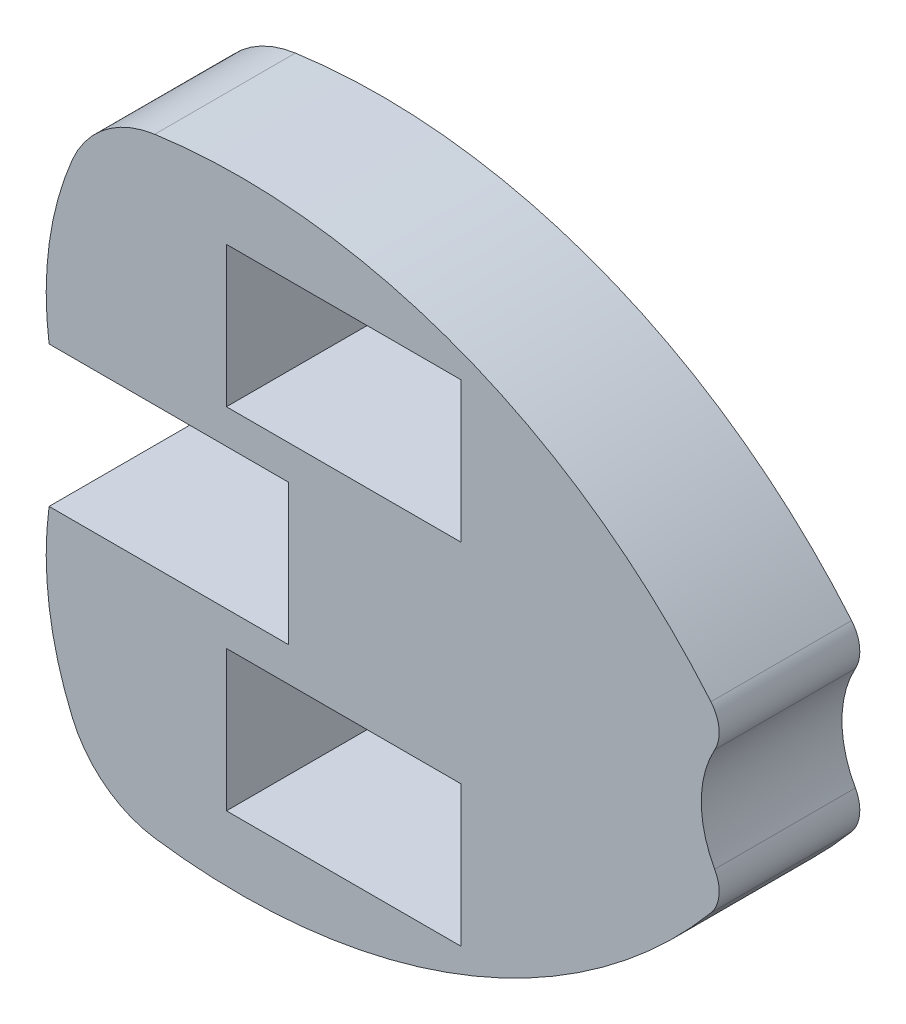
ISO-10303-21;
HEADER;
FILE_DESCRIPTION(('STEP AP214'),'2;1');
FILE_NAME('part.step','',(''),(''),'','','');
FILE_SCHEMA(('AUTOMOTIVE_DESIGN { 1 0 10303 214 1 1 1 1 }'));
ENDSEC;
DATA;
#1=APPLICATION_CONTEXT('core data for automotive mechanical design processes');
#2=APPLICATION_PROTOCOL_DEFINITION('international standard','automotive_design',2000,#1);
#3=PRODUCT_CONTEXT('',#1,'mechanical');
#4=PRODUCT('Part','Part','',(#3));
#5=PRODUCT_RELATED_PRODUCT_CATEGORY('part','',(#4));
#6=PRODUCT_DEFINITION_FORMATION('','',#4);
#7=PRODUCT_DEFINITION_CONTEXT('part definition',#1,'design');
#8=PRODUCT_DEFINITION('design','',#6,#7);
#9=PRODUCT_DEFINITION_SHAPE('','',#8);
#10=(LENGTH_UNIT() NAMED_UNIT(*) SI_UNIT(.MILLI.,.METRE.));
#11=(NAMED_UNIT(*) PLANE_ANGLE_UNIT() SI_UNIT($,.RADIAN.));
#12=(NAMED_UNIT(*) SI_UNIT($,.STERADIAN.) SOLID_ANGLE_UNIT());
#13=UNCERTAINTY_MEASURE_WITH_UNIT(LENGTH_MEASURE(1.E-05),#10,'distance_accuracy_value','');
#14=(GEOMETRIC_REPRESENTATION_CONTEXT(3) GLOBAL_UNCERTAINTY_ASSIGNED_CONTEXT((#13)) GLOBAL_UNIT_ASSIGNED_CONTEXT((#10,
#11,#12)) REPRESENTATION_CONTEXT('',''));
#15=CARTESIAN_POINT('',(0.,0.,0.));
#16=DIRECTION('',(0.,0.,1.));
#17=DIRECTION('',(1.,0.,0.));
#18=AXIS2_PLACEMENT_3D('',#15,#16,#17);
#19=CARTESIAN_POINT('',(110.892113400152,0.468034558923927,1.524));
#20=DIRECTION('',(0.,0.,-1.));
#21=DIRECTION('',(-1.,0.,0.));
#22=AXIS2_PLACEMENT_3D('',#19,#20,#21);
#23=PLANE('',#22);
#24=DIRECTION('',(0.,-1.,0.));
#25=VECTOR('',#24,1.);
#26=CARTESIAN_POINT('',(109.305658384387,-3.41975812334823,1.524));
#27=LINE('',#26,#25);
#28=CARTESIAN_POINT('',(109.305658384387,-1.89575812334823,1.524));
#29=VERTEX_POINT('',#28);
#30=CARTESIAN_POINT('',(109.305658384387,-3.41975812334823,1.524));
#31=VERTEX_POINT('',#30);
#32=EDGE_CURVE('E205',#29,#31,#27,.T.);
#33=ORIENTED_EDGE('',*,*,#32,.F.);
#34=DIRECTION('',(-1.,0.,0.));
#35=VECTOR('',#34,1.);
#36=CARTESIAN_POINT('',(109.305658384387,-1.89575812334823,1.524));
#37=LINE('',#36,#35);
#38=CARTESIAN_POINT('',(111.845658384387,-1.89575812334823,1.524));
#39=VERTEX_POINT('',#38);
#40=EDGE_CURVE('E213',#39,#29,#37,.T.);
#41=ORIENTED_EDGE('',*,*,#40,.F.);
#42=DIRECTION('',(0.,1.,0.));
#43=VECTOR('',#42,1.);
#44=CARTESIAN_POINT('',(111.845658384387,-3.41975812334823,1.524));
#45=LINE('',#44,#43);
#46=CARTESIAN_POINT('',(111.845658384387,-3.41975812334823,1.524));
#47=VERTEX_POINT('',#46);
#48=EDGE_CURVE('E210',#47,#39,#45,.T.);
#49=ORIENTED_EDGE('',*,*,#48,.F.);
#50=DIRECTION('',(1.,0.,0.));
#51=VECTOR('',#50,1.);
#52=CARTESIAN_POINT('',(109.305658384387,-3.41975812334823,1.524));
#53=LINE('',#52,#51);
#54=EDGE_CURVE('E207',#31,#47,#53,.T.);
#55=ORIENTED_EDGE('',*,*,#54,.F.);
#56=EDGE_LOOP('',(#33,#41,#49,#55));
#57=FACE_BOUND('',#56,.T.);
#58=DIRECTION('',(0.,-1.,0.));
#59=VECTOR('',#58,1.);
#60=CARTESIAN_POINT('',(109.97593860581,-1.524,1.524));
#61=LINE('',#60,#59);
#62=CARTESIAN_POINT('',(109.97593860581,0.,1.524));
#63=VERTEX_POINT('',#62);
#64=CARTESIAN_POINT('',(109.97593860581,-1.524,1.524));
#65=VERTEX_POINT('',#64);
#66=EDGE_CURVE('E236',#63,#65,#61,.T.);
#67=ORIENTED_EDGE('',*,*,#66,.T.);
#68=DIRECTION('',(-1.,0.,0.));
#69=VECTOR('',#68,1.);
#70=CARTESIAN_POINT('',(109.97593860581,-1.524,1.524));
#71=LINE('',#70,#69);
#72=CARTESIAN_POINT('',(107.383711033009,-1.524,1.524));
#73=VERTEX_POINT('',#72);
#74=EDGE_CURVE('E239',#65,#73,#71,.T.);
#75=ORIENTED_EDGE('',*,*,#74,.T.);
#76=CARTESIAN_POINT('',(110.892113400152,-1.99203455892393,1.524));
#77=DIRECTION('',(0.,0.,1.));
#78=DIRECTION('',(1.,0.,0.));
#79=AXIS2_PLACEMENT_3D('',#76,#77,#78);
#80=CIRCLE('',#79,3.53948351007892);
#81=CARTESIAN_POINT('',(107.636449137446,-3.38077273678905,1.524));
#82=VERTEX_POINT('',#81);
#83=EDGE_CURVE('E242',#73,#82,#80,.T.);
#84=ORIENTED_EDGE('',*,*,#83,.T.);
#85=CARTESIAN_POINT('',(108.687795821694,-2.93230963962248,1.524));
#86=DIRECTION('',(0.,0.,1.));
#87=DIRECTION('',(-1.,0.,0.));
#88=AXIS2_PLACEMENT_3D('',#85,#86,#87);
#89=CIRCLE('',#88,1.14300000000004);
#90=CARTESIAN_POINT('',(108.528537328871,-4.06416021830485,1.524));
#91=VERTEX_POINT('',#90);
#92=EDGE_CURVE('E244',#82,#91,#89,.T.);
#93=ORIENTED_EDGE('',*,*,#92,.T.);
#94=CARTESIAN_POINT('',(109.456196891648,2.52871903311373,1.524));
#95=DIRECTION('',(0.,0.,1.));
#96=DIRECTION('',(-1.,0.,0.));
#97=AXIS2_PLACEMENT_3D('',#94,#95,#96);
#98=CIRCLE('',#97,6.6578231493632);
#99=CARTESIAN_POINT('',(114.554773872381,-1.75276690750736,1.524));
#100=VERTEX_POINT('',#99);
#101=EDGE_CURVE('E246',#91,#100,#98,.T.);
#102=ORIENTED_EDGE('',*,*,#101,.T.);
#103=CARTESIAN_POINT('',(114.263003156025,-1.50775497090572,1.524));
#104=DIRECTION('',(0.,0.,1.));
#105=DIRECTION('',(1.,0.,0.));
#106=AXIS2_PLACEMENT_3D('',#103,#104,#105);
#107=CIRCLE('',#106,0.381);
#108=CARTESIAN_POINT('',(114.595869934512,-1.32238855598712,1.524));
#109=VERTEX_POINT('',#108);
#110=EDGE_CURVE('E248',#100,#109,#107,.T.);
#111=ORIENTED_EDGE('',*,*,#110,.T.);
#112=CARTESIAN_POINT('',(115.602172685818,-0.762,1.524));
#113=DIRECTION('',(0.,0.,-1.));
#114=DIRECTION('',(1.,0.,0.));
#115=AXIS2_PLACEMENT_3D('',#112,#113,#114);
#116=CIRCLE('',#115,1.15181620103541);
#117=CARTESIAN_POINT('',(114.595869934512,-0.201611444012883,1.524));
#118=VERTEX_POINT('',#117);
#119=EDGE_CURVE('E250',#109,#118,#116,.T.);
#120=ORIENTED_EDGE('',*,*,#119,.T.);
#121=CARTESIAN_POINT('',(114.263003156025,-0.0162450290942823,1.524));
#122=DIRECTION('',(0.,0.,1.));
#123=DIRECTION('',(-1.,0.,0.));
#124=AXIS2_PLACEMENT_3D('',#121,#122,#123);
#125=CIRCLE('',#124,0.381);
#126=CARTESIAN_POINT('',(114.554773872381,0.228766907507343,1.524));
#127=VERTEX_POINT('',#126);
#128=EDGE_CURVE('E252',#118,#127,#125,.T.);
#129=ORIENTED_EDGE('',*,*,#128,.T.);
#130=CARTESIAN_POINT('',(109.456196891648,-4.05271903311373,1.524));
#131=DIRECTION('',(0.,0.,1.));
#132=DIRECTION('',(1.,0.,0.));
#133=AXIS2_PLACEMENT_3D('',#130,#131,#132);
#134=CIRCLE('',#133,6.65782314936319);
#135=CARTESIAN_POINT('',(108.528537328871,2.54016021830481,1.524));
#136=VERTEX_POINT('',#135);
#137=EDGE_CURVE('E254',#127,#136,#134,.T.);
#138=ORIENTED_EDGE('',*,*,#137,.T.);
#139=CARTESIAN_POINT('',(108.687795821694,1.40830963962247,1.524));
#140=DIRECTION('',(0.,0.,1.));
#141=DIRECTION('',(1.,0.,0.));
#142=AXIS2_PLACEMENT_3D('',#139,#140,#141);
#143=CIRCLE('',#142,1.14300000000004);
#144=CARTESIAN_POINT('',(107.636449137446,1.856772736789,1.524));
#145=VERTEX_POINT('',#144);
#146=EDGE_CURVE('E256',#136,#145,#143,.T.);
#147=ORIENTED_EDGE('',*,*,#146,.T.);
#148=CARTESIAN_POINT('',(110.892113400152,0.468034558923927,1.524));
#149=DIRECTION('',(0.,0.,1.));
#150=DIRECTION('',(-1.,0.,0.));
#151=AXIS2_PLACEMENT_3D('',#148,#149,#150);
#152=CIRCLE('',#151,3.53948351007892);
#153=CARTESIAN_POINT('',(107.383711033009,0.,1.524));
#154=VERTEX_POINT('',#153);
#155=EDGE_CURVE('E258',#145,#154,#152,.T.);
#156=ORIENTED_EDGE('',*,*,#155,.T.);
#157=DIRECTION('',(1.,0.,0.));
#158=VECTOR('',#157,1.);
#159=CARTESIAN_POINT('',(107.383711033009,0.,1.524));
#160=LINE('',#159,#158);
#161=EDGE_CURVE('E260',#154,#63,#160,.T.);
#162=ORIENTED_EDGE('',*,*,#161,.T.);
#163=EDGE_LOOP('',(#67,#75,#84,#93,#102,#111,#120,#129,#138,#147,#156,#162));
#164=FACE_BOUND('',#163,.T.);
#165=DIRECTION('',(-1.,0.,0.));
#166=VECTOR('',#165,1.);
#167=CARTESIAN_POINT('',(109.305658384387,1.89575812334823,1.524));
#168=LINE('',#167,#166);
#169=CARTESIAN_POINT('',(111.845658384387,1.89575812334823,1.524));
#170=VERTEX_POINT('',#169);
#171=CARTESIAN_POINT('',(109.305658384387,1.89575812334823,1.524));
#172=VERTEX_POINT('',#171);
#173=EDGE_CURVE('E169',#170,#172,#168,.T.);
#174=ORIENTED_EDGE('',*,*,#173,.F.);
#175=DIRECTION('',(0.,1.,0.));
#176=VECTOR('',#175,1.);
#177=CARTESIAN_POINT('',(111.845658384387,1.89575812334823,1.524));
#178=LINE('',#177,#176);
#179=CARTESIAN_POINT('',(111.845658384387,0.37175812334823,1.524));
#180=VERTEX_POINT('',#179);
#181=EDGE_CURVE('E191',#180,#170,#178,.T.);
#182=ORIENTED_EDGE('',*,*,#181,.F.);
#183=DIRECTION('',(1.,0.,0.));
#184=VECTOR('',#183,1.);
#185=CARTESIAN_POINT('',(109.305658384387,0.37175812334823,1.524));
#186=LINE('',#185,#184);
#187=CARTESIAN_POINT('',(109.305658384387,0.37175812334823,1.524));
#188=VERTEX_POINT('',#187);
#189=EDGE_CURVE('E189',#188,#180,#186,.T.);
#190=ORIENTED_EDGE('',*,*,#189,.F.);
#191=DIRECTION('',(0.,-1.,0.));
#192=VECTOR('',#191,1.);
#193=CARTESIAN_POINT('',(109.305658384387,1.89575812334823,1.524));
#194=LINE('',#193,#192);
#195=EDGE_CURVE('E177',#172,#188,#194,.T.);
#196=ORIENTED_EDGE('',*,*,#195,.F.);
#197=EDGE_LOOP('',(#174,#182,#190,#196));
#198=FACE_BOUND('',#197,.T.);
#199=ADVANCED_FACE('F32',(#57,#164,#198),#23,.F.);
#200=CARTESIAN_POINT('',(110.892113400152,0.468034558923927,0.));
#201=DIRECTION('',(0.,0.,-1.));
#202=DIRECTION('',(-1.,0.,0.));
#203=AXIS2_PLACEMENT_3D('',#200,#201,#202);
#204=PLANE('',#203);
#205=DIRECTION('',(-1.,0.,0.));
#206=VECTOR('',#205,1.);
#207=CARTESIAN_POINT('',(109.305658384387,-1.89575812334823,0.));
#208=LINE('',#207,#206);
#209=CARTESIAN_POINT('',(111.845658384387,-1.89575812334823,0.));
#210=VERTEX_POINT('',#209);
#211=CARTESIAN_POINT('',(109.305658384387,-1.89575812334823,0.));
#212=VERTEX_POINT('',#211);
#213=EDGE_CURVE('E208',#210,#212,#208,.T.);
#214=ORIENTED_EDGE('',*,*,#213,.T.);
#215=DIRECTION('',(0.,-1.,0.));
#216=VECTOR('',#215,1.);
#217=CARTESIAN_POINT('',(109.305658384387,-3.41975812334823,0.));
#218=LINE('',#217,#216);
#219=CARTESIAN_POINT('',(109.305658384387,-3.41975812334823,0.));
#220=VERTEX_POINT('',#219);
#221=EDGE_CURVE('E185',#212,#220,#218,.T.);
#222=ORIENTED_EDGE('',*,*,#221,.T.);
#223=DIRECTION('',(1.,0.,0.));
#224=VECTOR('',#223,1.);
#225=CARTESIAN_POINT('',(109.305658384387,-3.41975812334823,0.));
#226=LINE('',#225,#224);
#227=CARTESIAN_POINT('',(111.845658384387,-3.41975812334823,0.));
#228=VERTEX_POINT('',#227);
#229=EDGE_CURVE('E218',#220,#228,#226,.T.);
#230=ORIENTED_EDGE('',*,*,#229,.T.);
#231=DIRECTION('',(0.,1.,0.));
#232=VECTOR('',#231,1.);
#233=CARTESIAN_POINT('',(111.845658384387,-3.41975812334823,0.));
#234=LINE('',#233,#232);
#235=EDGE_CURVE('E221',#228,#210,#234,.T.);
#236=ORIENTED_EDGE('',*,*,#235,.T.);
#237=EDGE_LOOP('',(#214,#222,#230,#236));
#238=FACE_BOUND('',#237,.T.);
#239=DIRECTION('',(0.,-1.,0.));
#240=VECTOR('',#239,1.);
#241=CARTESIAN_POINT('',(109.97593860581,-1.524,0.));
#242=LINE('',#241,#240);
#243=CARTESIAN_POINT('',(109.97593860581,0.,0.));
#244=VERTEX_POINT('',#243);
#245=CARTESIAN_POINT('',(109.97593860581,-1.524,0.));
#246=VERTEX_POINT('',#245);
#247=EDGE_CURVE('E235',#244,#246,#242,.T.);
#248=ORIENTED_EDGE('',*,*,#247,.F.);
#249=DIRECTION('',(1.,0.,0.));
#250=VECTOR('',#249,1.);
#251=CARTESIAN_POINT('',(107.383711033009,0.,0.));
#252=LINE('',#251,#250);
#253=CARTESIAN_POINT('',(107.383711033009,0.,0.));
#254=VERTEX_POINT('',#253);
#255=EDGE_CURVE('E240',#254,#244,#252,.T.);
#256=ORIENTED_EDGE('',*,*,#255,.F.);
#257=CARTESIAN_POINT('',(110.892113400152,0.468034558923927,0.));
#258=DIRECTION('',(0.,0.,1.));
#259=DIRECTION('',(-1.,0.,0.));
#260=AXIS2_PLACEMENT_3D('',#257,#258,#259);
#261=CIRCLE('',#260,3.53948351007892);
#262=CARTESIAN_POINT('',(107.636449137446,1.856772736789,0.));
#263=VERTEX_POINT('',#262);
#264=EDGE_CURVE('E283',#263,#254,#261,.T.);
#265=ORIENTED_EDGE('',*,*,#264,.F.);
#266=CARTESIAN_POINT('',(108.687795821694,1.40830963962247,0.));
#267=DIRECTION('',(0.,0.,1.));
#268=DIRECTION('',(1.,0.,0.));
#269=AXIS2_PLACEMENT_3D('',#266,#267,#268);
#270=CIRCLE('',#269,1.14300000000004);
#271=CARTESIAN_POINT('',(108.528537328871,2.54016021830481,0.));
#272=VERTEX_POINT('',#271);
#273=EDGE_CURVE('E281',#272,#263,#270,.T.);
#274=ORIENTED_EDGE('',*,*,#273,.F.);
#275=CARTESIAN_POINT('',(109.456196891648,-4.05271903311373,0.));
#276=DIRECTION('',(0.,0.,1.));
#277=DIRECTION('',(1.,0.,0.));
#278=AXIS2_PLACEMENT_3D('',#275,#276,#277);
#279=CIRCLE('',#278,6.65782314936319);
#280=CARTESIAN_POINT('',(114.554773872381,0.228766907507343,0.));
#281=VERTEX_POINT('',#280);
#282=EDGE_CURVE('E279',#281,#272,#279,.T.);
#283=ORIENTED_EDGE('',*,*,#282,.F.);
#284=CARTESIAN_POINT('',(114.263003156025,-0.0162450290942823,0.));
#285=DIRECTION('',(0.,0.,1.));
#286=DIRECTION('',(-1.,0.,0.));
#287=AXIS2_PLACEMENT_3D('',#284,#285,#286);
#288=CIRCLE('',#287,0.381);
#289=CARTESIAN_POINT('',(114.595869934512,-0.201611444012883,0.));
#290=VERTEX_POINT('',#289);
#291=EDGE_CURVE('E277',#290,#281,#288,.T.);
#292=ORIENTED_EDGE('',*,*,#291,.F.);
#293=CARTESIAN_POINT('',(115.602172685818,-0.762,0.));
#294=DIRECTION('',(0.,0.,-1.));
#295=DIRECTION('',(1.,0.,0.));
#296=AXIS2_PLACEMENT_3D('',#293,#294,#295);
#297=CIRCLE('',#296,1.15181620103541);
#298=CARTESIAN_POINT('',(114.595869934512,-1.32238855598712,0.));
#299=VERTEX_POINT('',#298);
#300=EDGE_CURVE('E275',#299,#290,#297,.T.);
#301=ORIENTED_EDGE('',*,*,#300,.F.);
#302=CARTESIAN_POINT('',(114.263003156025,-1.50775497090572,0.));
#303=DIRECTION('',(0.,0.,1.));
#304=DIRECTION('',(1.,0.,0.));
#305=AXIS2_PLACEMENT_3D('',#302,#303,#304);
#306=CIRCLE('',#305,0.381);
#307=CARTESIAN_POINT('',(114.554773872381,-1.75276690750736,0.));
#308=VERTEX_POINT('',#307);
#309=EDGE_CURVE('E273',#308,#299,#306,.T.);
#310=ORIENTED_EDGE('',*,*,#309,.F.);
#311=CARTESIAN_POINT('',(109.456196891648,2.52871903311373,0.));
#312=DIRECTION('',(0.,0.,1.));
#313=DIRECTION('',(-1.,0.,0.));
#314=AXIS2_PLACEMENT_3D('',#311,#312,#313);
#315=CIRCLE('',#314,6.6578231493632);
#316=CARTESIAN_POINT('',(108.528537328871,-4.06416021830485,0.));
#317=VERTEX_POINT('',#316);
#318=EDGE_CURVE('E271',#317,#308,#315,.T.);
#319=ORIENTED_EDGE('',*,*,#318,.F.);
#320=CARTESIAN_POINT('',(108.687795821694,-2.93230963962248,0.));
#321=DIRECTION('',(0.,0.,1.));
#322=DIRECTION('',(-1.,0.,0.));
#323=AXIS2_PLACEMENT_3D('',#320,#321,#322);
#324=CIRCLE('',#323,1.14300000000004);
#325=CARTESIAN_POINT('',(107.636449137446,-3.38077273678905,0.));
#326=VERTEX_POINT('',#325);
#327=EDGE_CURVE('E269',#326,#317,#324,.T.);
#328=ORIENTED_EDGE('',*,*,#327,.F.);
#329=CARTESIAN_POINT('',(110.892113400152,-1.99203455892393,0.));
#330=DIRECTION('',(0.,0.,1.));
#331=DIRECTION('',(1.,0.,0.));
#332=AXIS2_PLACEMENT_3D('',#329,#330,#331);
#333=CIRCLE('',#332,3.53948351007892);
#334=CARTESIAN_POINT('',(107.383711033009,-1.524,0.));
#335=VERTEX_POINT('',#334);
#336=EDGE_CURVE('E267',#335,#326,#333,.T.);
#337=ORIENTED_EDGE('',*,*,#336,.F.);
#338=DIRECTION('',(-1.,0.,0.));
#339=VECTOR('',#338,1.);
#340=CARTESIAN_POINT('',(109.97593860581,-1.524,0.));
#341=LINE('',#340,#339);
#342=EDGE_CURVE('E265',#246,#335,#341,.T.);
#343=ORIENTED_EDGE('',*,*,#342,.F.);
#344=EDGE_LOOP('',(#248,#256,#265,#274,#283,#292,#301,#310,#319,#328,#337,#343));
#345=FACE_BOUND('',#344,.T.);
#346=DIRECTION('',(0.,1.,0.));
#347=VECTOR('',#346,1.);
#348=CARTESIAN_POINT('',(111.845658384387,1.89575812334823,0.));
#349=LINE('',#348,#347);
#350=CARTESIAN_POINT('',(111.845658384387,0.37175812334823,0.));
#351=VERTEX_POINT('',#350);
#352=CARTESIAN_POINT('',(111.845658384387,1.89575812334823,0.));
#353=VERTEX_POINT('',#352);
#354=EDGE_CURVE('E178',#351,#353,#349,.T.);
#355=ORIENTED_EDGE('',*,*,#354,.T.);
#356=DIRECTION('',(-1.,0.,0.));
#357=VECTOR('',#356,1.);
#358=CARTESIAN_POINT('',(109.305658384387,1.89575812334823,0.));
#359=LINE('',#358,#357);
#360=CARTESIAN_POINT('',(109.305658384387,1.89575812334823,0.));
#361=VERTEX_POINT('',#360);
#362=EDGE_CURVE('E55',#353,#361,#359,.T.);
#363=ORIENTED_EDGE('',*,*,#362,.T.);
#364=DIRECTION('',(0.,-1.,0.));
#365=VECTOR('',#364,1.);
#366=CARTESIAN_POINT('',(109.305658384387,1.89575812334823,0.));
#367=LINE('',#366,#365);
#368=CARTESIAN_POINT('',(109.305658384387,0.37175812334823,0.));
#369=VERTEX_POINT('',#368);
#370=EDGE_CURVE('E184',#361,#369,#367,.T.);
#371=ORIENTED_EDGE('',*,*,#370,.T.);
#372=DIRECTION('',(1.,0.,0.));
#373=VECTOR('',#372,1.);
#374=CARTESIAN_POINT('',(109.305658384387,0.37175812334823,0.));
#375=LINE('',#374,#373);
#376=EDGE_CURVE('E197',#369,#351,#375,.T.);
#377=ORIENTED_EDGE('',*,*,#376,.T.);
#378=EDGE_LOOP('',(#355,#363,#371,#377));
#379=FACE_BOUND('',#378,.T.);
#380=ADVANCED_FACE('F325',(#238,#345,#379),#204,.T.);
#381=CARTESIAN_POINT('',(109.97593860581,-1.524,1.524));
#382=DIRECTION('',(1.,0.,0.));
#383=DIRECTION('',(0.,0.,-1.));
#384=AXIS2_PLACEMENT_3D('',#381,#382,#383);
#385=PLANE('',#384);
#386=ORIENTED_EDGE('',*,*,#247,.T.);
#387=DIRECTION('',(0.,0.,-1.));
#388=VECTOR('',#387,1.);
#389=CARTESIAN_POINT('',(109.97593860581,-1.524,1.524));
#390=LINE('',#389,#388);
#391=EDGE_CURVE('E11',#65,#246,#390,.T.);
#392=ORIENTED_EDGE('',*,*,#391,.F.);
#393=ORIENTED_EDGE('',*,*,#66,.F.);
#394=DIRECTION('',(0.,0.,-1.));
#395=VECTOR('',#394,1.);
#396=CARTESIAN_POINT('',(109.97593860581,0.,1.524));
#397=LINE('',#396,#395);
#398=EDGE_CURVE('E262',#63,#244,#397,.T.);
#399=ORIENTED_EDGE('',*,*,#398,.T.);
#400=EDGE_LOOP('',(#386,#392,#393,#399));
#401=FACE_BOUND('',#400,.T.);
#402=ADVANCED_FACE('F34',(#401),#385,.F.);
#403=CARTESIAN_POINT('',(109.97593860581,-1.524,1.524));
#404=DIRECTION('',(0.,-1.,0.));
#405=DIRECTION('',(1.,0.,0.));
#406=AXIS2_PLACEMENT_3D('',#403,#404,#405);
#407=PLANE('',#406);
#408=ORIENTED_EDGE('',*,*,#342,.T.);
#409=DIRECTION('',(0.,0.,-1.));
#410=VECTOR('',#409,1.);
#411=CARTESIAN_POINT('',(107.383711033009,-1.524,1.524));
#412=LINE('',#411,#410);
#413=EDGE_CURVE('E40',#73,#335,#412,.T.);
#414=ORIENTED_EDGE('',*,*,#413,.F.);
#415=ORIENTED_EDGE('',*,*,#74,.F.);
#416=ORIENTED_EDGE('',*,*,#391,.T.);
#417=EDGE_LOOP('',(#408,#414,#415,#416));
#418=FACE_BOUND('',#417,.T.);
#419=ADVANCED_FACE('F342',(#418),#407,.F.);
#420=CARTESIAN_POINT('',(110.892113400152,-1.99203455892393,1.524));
#421=DIRECTION('',(0.,0.,-1.));
#422=DIRECTION('',(-1.,0.,0.));
#423=AXIS2_PLACEMENT_3D('',#420,#421,#422);
#424=CYLINDRICAL_SURFACE('',#423,3.53948351007892);
#425=ORIENTED_EDGE('',*,*,#336,.T.);
#426=DIRECTION('',(0.,0.,-1.));
#427=VECTOR('',#426,1.);
#428=CARTESIAN_POINT('',(107.636449137446,-3.38077273678905,1.524));
#429=LINE('',#428,#427);
#430=EDGE_CURVE('E312',#82,#326,#429,.T.);
#431=ORIENTED_EDGE('',*,*,#430,.F.);
#432=ORIENTED_EDGE('',*,*,#83,.F.);
#433=ORIENTED_EDGE('',*,*,#413,.T.);
#434=EDGE_LOOP('',(#425,#431,#432,#433));
#435=FACE_BOUND('',#434,.T.);
#436=ADVANCED_FACE('F319',(#435),#424,.T.);
#437=CARTESIAN_POINT('',(108.687795821694,-2.93230963962248,1.524));
#438=DIRECTION('',(0.,0.,-1.));
#439=DIRECTION('',(-1.,0.,0.));
#440=AXIS2_PLACEMENT_3D('',#437,#438,#439);
#441=CYLINDRICAL_SURFACE('',#440,1.14300000000004);
#442=ORIENTED_EDGE('',*,*,#327,.T.);
#443=DIRECTION('',(0.,0.,-1.));
#444=VECTOR('',#443,1.);
#445=CARTESIAN_POINT('',(108.528537328871,-4.06416021830485,1.524));
#446=LINE('',#445,#444);
#447=EDGE_CURVE('E309',#91,#317,#446,.T.);
#448=ORIENTED_EDGE('',*,*,#447,.F.);
#449=ORIENTED_EDGE('',*,*,#92,.F.);
#450=ORIENTED_EDGE('',*,*,#430,.T.);
#451=EDGE_LOOP('',(#442,#448,#449,#450));
#452=FACE_BOUND('',#451,.T.);
#453=ADVANCED_FACE('F331',(#452),#441,.T.);
#454=CARTESIAN_POINT('',(109.456196891648,2.52871903311373,1.524));
#455=DIRECTION('',(0.,0.,-1.));
#456=DIRECTION('',(-1.,0.,0.));
#457=AXIS2_PLACEMENT_3D('',#454,#455,#456);
#458=CYLINDRICAL_SURFACE('',#457,6.6578231493632);
#459=ORIENTED_EDGE('',*,*,#318,.T.);
#460=DIRECTION('',(0.,0.,-1.));
#461=VECTOR('',#460,1.);
#462=CARTESIAN_POINT('',(114.554773872381,-1.75276690750736,1.524));
#463=LINE('',#462,#461);
#464=EDGE_CURVE('E306',#100,#308,#463,.T.);
#465=ORIENTED_EDGE('',*,*,#464,.F.);
#466=ORIENTED_EDGE('',*,*,#101,.F.);
#467=ORIENTED_EDGE('',*,*,#447,.T.);
#468=EDGE_LOOP('',(#459,#465,#466,#467));
#469=FACE_BOUND('',#468,.T.);
#470=ADVANCED_FACE('F335',(#469),#458,.T.);
#471=CARTESIAN_POINT('',(114.263003156025,-1.50775497090572,1.524));
#472=DIRECTION('',(0.,0.,-1.));
#473=DIRECTION('',(-1.,0.,0.));
#474=AXIS2_PLACEMENT_3D('',#471,#472,#473);
#475=CYLINDRICAL_SURFACE('',#474,0.381);
#476=ORIENTED_EDGE('',*,*,#309,.T.);
#477=DIRECTION('',(0.,0.,-1.));
#478=VECTOR('',#477,1.);
#479=CARTESIAN_POINT('',(114.595869934512,-1.32238855598712,1.524));
#480=LINE('',#479,#478);
#481=EDGE_CURVE('E303',#109,#299,#480,.T.);
#482=ORIENTED_EDGE('',*,*,#481,.F.);
#483=ORIENTED_EDGE('',*,*,#110,.F.);
#484=ORIENTED_EDGE('',*,*,#464,.T.);
#485=EDGE_LOOP('',(#476,#482,#483,#484));
#486=FACE_BOUND('',#485,.T.);
#487=ADVANCED_FACE('F375',(#486),#475,.T.);
#488=CARTESIAN_POINT('',(115.602172685818,-0.762,1.524));
#489=DIRECTION('',(0.,0.,-1.));
#490=DIRECTION('',(-1.,0.,0.));
#491=AXIS2_PLACEMENT_3D('',#488,#489,#490);
#492=CYLINDRICAL_SURFACE('',#491,1.15181620103541);
#493=ORIENTED_EDGE('',*,*,#300,.T.);
#494=DIRECTION('',(0.,0.,-1.));
#495=VECTOR('',#494,1.);
#496=CARTESIAN_POINT('',(114.595869934512,-0.201611444012883,1.524));
#497=LINE('',#496,#495);
#498=EDGE_CURVE('E300',#118,#290,#497,.T.);
#499=ORIENTED_EDGE('',*,*,#498,.F.);
#500=ORIENTED_EDGE('',*,*,#119,.F.);
#501=ORIENTED_EDGE('',*,*,#481,.T.);
#502=EDGE_LOOP('',(#493,#499,#500,#501));
#503=FACE_BOUND('',#502,.T.);
#504=ADVANCED_FACE('F373',(#503),#492,.F.);
#505=CARTESIAN_POINT('',(114.263003156025,-0.0162450290942823,1.524));
#506=DIRECTION('',(0.,0.,-1.));
#507=DIRECTION('',(-1.,0.,0.));
#508=AXIS2_PLACEMENT_3D('',#505,#506,#507);
#509=CYLINDRICAL_SURFACE('',#508,0.381);
#510=ORIENTED_EDGE('',*,*,#291,.T.);
#511=DIRECTION('',(0.,0.,-1.));
#512=VECTOR('',#511,1.);
#513=CARTESIAN_POINT('',(114.554773872381,0.228766907507343,1.524));
#514=LINE('',#513,#512);
#515=EDGE_CURVE('E297',#127,#281,#514,.T.);
#516=ORIENTED_EDGE('',*,*,#515,.F.);
#517=ORIENTED_EDGE('',*,*,#128,.F.);
#518=ORIENTED_EDGE('',*,*,#498,.T.);
#519=EDGE_LOOP('',(#510,#516,#517,#518));
#520=FACE_BOUND('',#519,.T.);
#521=ADVANCED_FACE('F369',(#520),#509,.T.);
#522=CARTESIAN_POINT('',(109.456196891648,-4.05271903311373,1.524));
#523=DIRECTION('',(0.,0.,-1.));
#524=DIRECTION('',(-1.,0.,0.));
#525=AXIS2_PLACEMENT_3D('',#522,#523,#524);
#526=CYLINDRICAL_SURFACE('',#525,6.65782314936319);
#527=ORIENTED_EDGE('',*,*,#282,.T.);
#528=DIRECTION('',(0.,0.,-1.));
#529=VECTOR('',#528,1.);
#530=CARTESIAN_POINT('',(108.528537328871,2.54016021830481,1.524));
#531=LINE('',#530,#529);
#532=EDGE_CURVE('E294',#136,#272,#531,.T.);
#533=ORIENTED_EDGE('',*,*,#532,.F.);
#534=ORIENTED_EDGE('',*,*,#137,.F.);
#535=ORIENTED_EDGE('',*,*,#515,.T.);
#536=EDGE_LOOP('',(#527,#533,#534,#535));
#537=FACE_BOUND('',#536,.T.);
#538=ADVANCED_FACE('F364',(#537),#526,.T.);
#539=CARTESIAN_POINT('',(108.687795821694,1.40830963962247,1.524));
#540=DIRECTION('',(0.,0.,-1.));
#541=DIRECTION('',(-1.,0.,0.));
#542=AXIS2_PLACEMENT_3D('',#539,#540,#541);
#543=CYLINDRICAL_SURFACE('',#542,1.14300000000004);
#544=ORIENTED_EDGE('',*,*,#273,.T.);
#545=DIRECTION('',(0.,0.,-1.));
#546=VECTOR('',#545,1.);
#547=CARTESIAN_POINT('',(107.636449137446,1.856772736789,1.524));
#548=LINE('',#547,#546);
#549=EDGE_CURVE('E291',#145,#263,#548,.T.);
#550=ORIENTED_EDGE('',*,*,#549,.F.);
#551=ORIENTED_EDGE('',*,*,#146,.F.);
#552=ORIENTED_EDGE('',*,*,#532,.T.);
#553=EDGE_LOOP('',(#544,#550,#551,#552));
#554=FACE_BOUND('',#553,.T.);
#555=ADVANCED_FACE('F358',(#554),#543,.T.);
#556=CARTESIAN_POINT('',(110.892113400152,0.468034558923927,1.524));
#557=DIRECTION('',(0.,0.,-1.));
#558=DIRECTION('',(-1.,0.,0.));
#559=AXIS2_PLACEMENT_3D('',#556,#557,#558);
#560=CYLINDRICAL_SURFACE('',#559,3.53948351007892);
#561=ORIENTED_EDGE('',*,*,#264,.T.);
#562=DIRECTION('',(0.,0.,-1.));
#563=VECTOR('',#562,1.);
#564=CARTESIAN_POINT('',(107.383711033009,0.,1.524));
#565=LINE('',#564,#563);
#566=EDGE_CURVE('E288',#154,#254,#565,.T.);
#567=ORIENTED_EDGE('',*,*,#566,.F.);
#568=ORIENTED_EDGE('',*,*,#155,.F.);
#569=ORIENTED_EDGE('',*,*,#549,.T.);
#570=EDGE_LOOP('',(#561,#567,#568,#569));
#571=FACE_BOUND('',#570,.T.);
#572=ADVANCED_FACE('F354',(#571),#560,.T.);
#573=CARTESIAN_POINT('',(107.383711033009,0.,1.524));
#574=DIRECTION('',(0.,1.,0.));
#575=DIRECTION('',(-1.,0.,0.));
#576=AXIS2_PLACEMENT_3D('',#573,#574,#575);
#577=PLANE('',#576);
#578=ORIENTED_EDGE('',*,*,#255,.T.);
#579=ORIENTED_EDGE('',*,*,#398,.F.);
#580=ORIENTED_EDGE('',*,*,#161,.F.);
#581=ORIENTED_EDGE('',*,*,#566,.T.);
#582=EDGE_LOOP('',(#578,#579,#580,#581));
#583=FACE_BOUND('',#582,.T.);
#584=ADVANCED_FACE('F349',(#583),#577,.F.);
#585=CARTESIAN_POINT('',(109.305658384387,-3.41975812334823,1.524));
#586=DIRECTION('',(1.,0.,0.));
#587=DIRECTION('',(0.,0.,-1.));
#588=AXIS2_PLACEMENT_3D('',#585,#586,#587);
#589=PLANE('',#588);
#590=ORIENTED_EDGE('',*,*,#221,.F.);
#591=DIRECTION('',(0.,0.,-1.));
#592=VECTOR('',#591,1.);
#593=CARTESIAN_POINT('',(109.305658384387,-1.89575812334823,1.524));
#594=LINE('',#593,#592);
#595=EDGE_CURVE('E215',#29,#212,#594,.T.);
#596=ORIENTED_EDGE('',*,*,#595,.F.);
#597=ORIENTED_EDGE('',*,*,#32,.T.);
#598=DIRECTION('',(0.,0.,-1.));
#599=VECTOR('',#598,1.);
#600=CARTESIAN_POINT('',(109.305658384387,-3.41975812334823,1.524));
#601=LINE('',#600,#599);
#602=EDGE_CURVE('E232',#31,#220,#601,.T.);
#603=ORIENTED_EDGE('',*,*,#602,.T.);
#604=EDGE_LOOP('',(#590,#596,#597,#603));
#605=FACE_BOUND('',#604,.T.);
#606=ADVANCED_FACE('F394',(#605),#589,.T.);
#607=CARTESIAN_POINT('',(109.305658384387,-3.41975812334823,1.524));
#608=DIRECTION('',(0.,1.,0.));
#609=DIRECTION('',(0.,0.,1.));
#610=AXIS2_PLACEMENT_3D('',#607,#608,#609);
#611=PLANE('',#610);
#612=ORIENTED_EDGE('',*,*,#229,.F.);
#613=ORIENTED_EDGE('',*,*,#602,.F.);
#614=ORIENTED_EDGE('',*,*,#54,.T.);
#615=DIRECTION('',(0.,0.,-1.));
#616=VECTOR('',#615,1.);
#617=CARTESIAN_POINT('',(111.845658384387,-3.41975812334823,1.524));
#618=LINE('',#617,#616);
#619=EDGE_CURVE('E230',#47,#228,#618,.T.);
#620=ORIENTED_EDGE('',*,*,#619,.T.);
#621=EDGE_LOOP('',(#612,#613,#614,#620));
#622=FACE_BOUND('',#621,.T.);
#623=ADVANCED_FACE('F432',(#622),#611,.T.);
#624=CARTESIAN_POINT('',(111.845658384387,-3.41975812334823,1.524));
#625=DIRECTION('',(-1.,0.,0.));
#626=DIRECTION('',(0.,0.,1.));
#627=AXIS2_PLACEMENT_3D('',#624,#625,#626);
#628=PLANE('',#627);
#629=ORIENTED_EDGE('',*,*,#235,.F.);
#630=ORIENTED_EDGE('',*,*,#619,.F.);
#631=ORIENTED_EDGE('',*,*,#48,.T.);
#632=DIRECTION('',(0.,0.,-1.));
#633=VECTOR('',#632,1.);
#634=CARTESIAN_POINT('',(111.845658384387,-1.89575812334823,1.524));
#635=LINE('',#634,#633);
#636=EDGE_CURVE('E228',#39,#210,#635,.T.);
#637=ORIENTED_EDGE('',*,*,#636,.T.);
#638=EDGE_LOOP('',(#629,#630,#631,#637));
#639=FACE_BOUND('',#638,.T.);
#640=ADVANCED_FACE('F439',(#639),#628,.T.);
#641=CARTESIAN_POINT('',(109.305658384387,-1.89575812334823,1.524));
#642=DIRECTION('',(0.,-1.,0.));
#643=DIRECTION('',(0.,0.,-1.));
#644=AXIS2_PLACEMENT_3D('',#641,#642,#643);
#645=PLANE('',#644);
#646=ORIENTED_EDGE('',*,*,#213,.F.);
#647=ORIENTED_EDGE('',*,*,#636,.F.);
#648=ORIENTED_EDGE('',*,*,#40,.T.);
#649=ORIENTED_EDGE('',*,*,#595,.T.);
#650=EDGE_LOOP('',(#646,#647,#648,#649));
#651=FACE_BOUND('',#650,.T.);
#652=ADVANCED_FACE('F446',(#651),#645,.T.);
#653=CARTESIAN_POINT('',(109.305658384387,1.89575812334823,1.524));
#654=DIRECTION('',(0.,-1.,0.));
#655=DIRECTION('',(0.,0.,-1.));
#656=AXIS2_PLACEMENT_3D('',#653,#654,#655);
#657=PLANE('',#656);
#658=ORIENTED_EDGE('',*,*,#362,.F.);
#659=DIRECTION('',(0.,0.,-1.));
#660=VECTOR('',#659,1.);
#661=CARTESIAN_POINT('',(111.845658384387,1.89575812334823,1.524));
#662=LINE('',#661,#660);
#663=EDGE_CURVE('E173',#170,#353,#662,.T.);
#664=ORIENTED_EDGE('',*,*,#663,.F.);
#665=ORIENTED_EDGE('',*,*,#173,.T.);
#666=DIRECTION('',(0.,0.,-1.));
#667=VECTOR('',#666,1.);
#668=CARTESIAN_POINT('',(109.305658384387,1.89575812334823,1.524));
#669=LINE('',#668,#667);
#670=EDGE_CURVE('E172',#172,#361,#669,.T.);
#671=ORIENTED_EDGE('',*,*,#670,.T.);
#672=EDGE_LOOP('',(#658,#664,#665,#671));
#673=FACE_BOUND('',#672,.T.);
#674=ADVANCED_FACE('F171',(#673),#657,.T.);
#675=CARTESIAN_POINT('',(109.305658384387,1.89575812334823,1.524));
#676=DIRECTION('',(1.,0.,0.));
#677=DIRECTION('',(0.,0.,-1.));
#678=AXIS2_PLACEMENT_3D('',#675,#676,#677);
#679=PLANE('',#678);
#680=ORIENTED_EDGE('',*,*,#370,.F.);
#681=ORIENTED_EDGE('',*,*,#670,.F.);
#682=ORIENTED_EDGE('',*,*,#195,.T.);
#683=DIRECTION('',(0.,0.,-1.));
#684=VECTOR('',#683,1.);
#685=CARTESIAN_POINT('',(109.305658384387,0.37175812334823,1.524));
#686=LINE('',#685,#684);
#687=EDGE_CURVE('E186',#188,#369,#686,.T.);
#688=ORIENTED_EDGE('',*,*,#687,.T.);
#689=EDGE_LOOP('',(#680,#681,#682,#688));
#690=FACE_BOUND('',#689,.T.);
#691=ADVANCED_FACE('F181',(#690),#679,.T.);
#692=CARTESIAN_POINT('',(109.305658384387,0.37175812334823,1.524));
#693=DIRECTION('',(0.,1.,0.));
#694=DIRECTION('',(0.,0.,1.));
#695=AXIS2_PLACEMENT_3D('',#692,#693,#694);
#696=PLANE('',#695);
#697=ORIENTED_EDGE('',*,*,#376,.F.);
#698=ORIENTED_EDGE('',*,*,#687,.F.);
#699=ORIENTED_EDGE('',*,*,#189,.T.);
#700=DIRECTION('',(0.,0.,-1.));
#701=VECTOR('',#700,1.);
#702=CARTESIAN_POINT('',(111.845658384387,0.37175812334823,1.524));
#703=LINE('',#702,#701);
#704=EDGE_CURVE('E47',#180,#351,#703,.T.);
#705=ORIENTED_EDGE('',*,*,#704,.T.);
#706=EDGE_LOOP('',(#697,#698,#699,#705));
#707=FACE_BOUND('',#706,.T.);
#708=ADVANCED_FACE('F467',(#707),#696,.T.);
#709=CARTESIAN_POINT('',(111.845658384387,1.89575812334823,1.524));
#710=DIRECTION('',(-1.,0.,0.));
#711=DIRECTION('',(0.,0.,1.));
#712=AXIS2_PLACEMENT_3D('',#709,#710,#711);
#713=PLANE('',#712);
#714=ORIENTED_EDGE('',*,*,#354,.F.);
#715=ORIENTED_EDGE('',*,*,#704,.F.);
#716=ORIENTED_EDGE('',*,*,#181,.T.);
#717=ORIENTED_EDGE('',*,*,#663,.T.);
#718=EDGE_LOOP('',(#714,#715,#716,#717));
#719=FACE_BOUND('',#718,.T.);
#720=ADVANCED_FACE('F474',(#719),#713,.T.);
#721=CLOSED_SHELL('',(#199,#380,#402,#419,#436,#453,#470,#487,#504,#521,#538,#555,#572,#584,
#606,#623,#640,#652,#674,#691,#708,#720));
#722=MANIFOLD_SOLID_BREP('B2',#721);
#723=ADVANCED_BREP_SHAPE_REPRESENTATION('',(#18,#722),#14);
#724=SHAPE_DEFINITION_REPRESENTATION(#9,#723);
ENDSEC;
END-ISO-10303-21;
